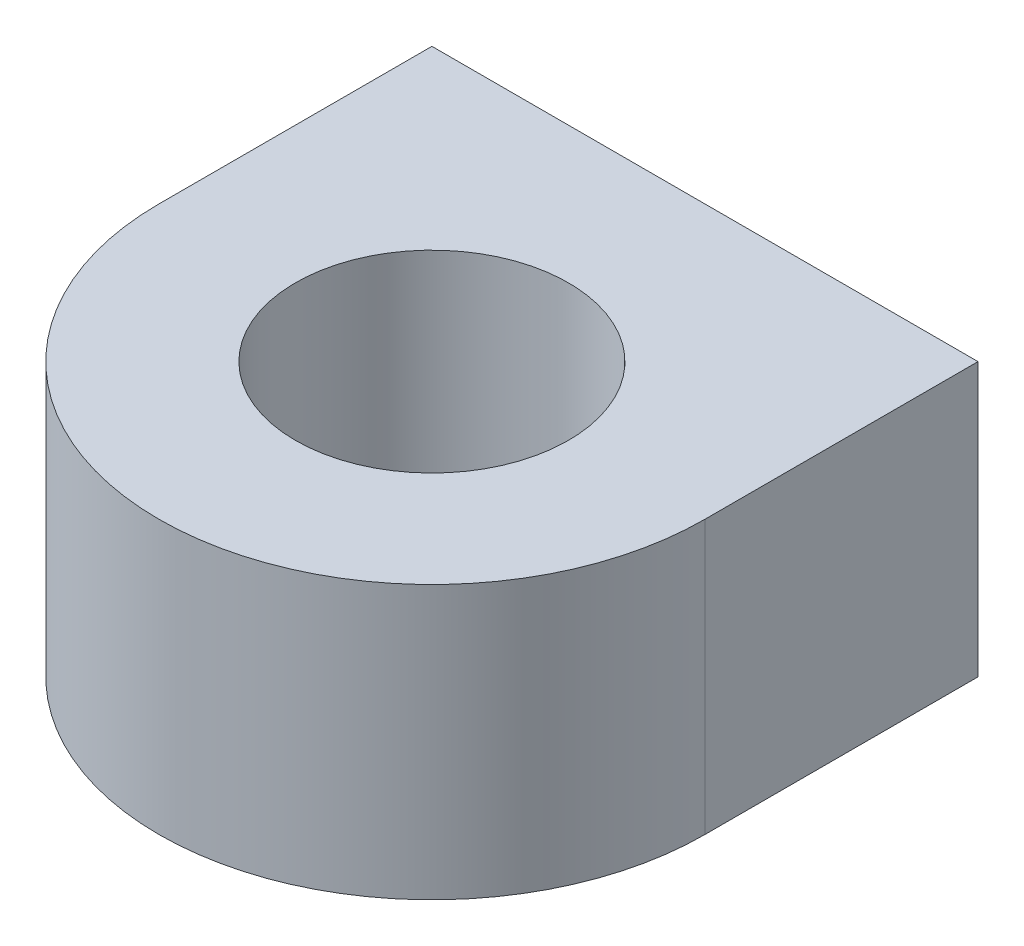
ISO-10303-21;
HEADER;
FILE_DESCRIPTION(('STEP AP214'),'2;1');
FILE_NAME('part.step','',(''),(''),'','','');
FILE_SCHEMA(('AUTOMOTIVE_DESIGN { 1 0 10303 214 1 1 1 1 }'));
ENDSEC;
DATA;
#1=APPLICATION_CONTEXT('core data for automotive mechanical design processes');
#2=APPLICATION_PROTOCOL_DEFINITION('international standard','automotive_design',2000,#1);
#3=PRODUCT_CONTEXT('',#1,'mechanical');
#4=PRODUCT('Part','Part','',(#3));
#5=PRODUCT_RELATED_PRODUCT_CATEGORY('part','',(#4));
#6=PRODUCT_DEFINITION_FORMATION('','',#4);
#7=PRODUCT_DEFINITION_CONTEXT('part definition',#1,'design');
#8=PRODUCT_DEFINITION('design','',#6,#7);
#9=PRODUCT_DEFINITION_SHAPE('','',#8);
#10=(LENGTH_UNIT() NAMED_UNIT(*) SI_UNIT(.MILLI.,.METRE.));
#11=(NAMED_UNIT(*) PLANE_ANGLE_UNIT() SI_UNIT($,.RADIAN.));
#12=(NAMED_UNIT(*) SI_UNIT($,.STERADIAN.) SOLID_ANGLE_UNIT());
#13=UNCERTAINTY_MEASURE_WITH_UNIT(LENGTH_MEASURE(1.E-05),#10,'distance_accuracy_value','');
#14=(GEOMETRIC_REPRESENTATION_CONTEXT(3) GLOBAL_UNCERTAINTY_ASSIGNED_CONTEXT((#13)) GLOBAL_UNIT_ASSIGNED_CONTEXT((#10,
#11,#12)) REPRESENTATION_CONTEXT('',''));
#15=CARTESIAN_POINT('',(0.,0.,0.));
#16=DIRECTION('',(0.,0.,1.));
#17=DIRECTION('',(1.,0.,0.));
#18=AXIS2_PLACEMENT_3D('',#15,#16,#17);
#19=CARTESIAN_POINT('',(159.769621432495,37.544015335187,10.));
#20=DIRECTION('',(0.,1.,0.));
#21=DIRECTION('',(0.,0.,1.));
#22=AXIS2_PLACEMENT_3D('',#19,#20,#21);
#23=PLANE('',#22);
#24=CARTESIAN_POINT('',(164.769621432495,37.544015335187,4.99999999999999));
#25=DIRECTION('',(0.,1.,0.));
#26=DIRECTION('',(0.,0.,1.));
#27=AXIS2_PLACEMENT_3D('',#24,#25,#26);
#28=CIRCLE('',#27,2.5);
#29=CARTESIAN_POINT('',(164.769621432495,37.544015335187,7.49999999999999));
#30=VERTEX_POINT('',#29);
#31=EDGE_CURVE('E150',#30,#30,#28,.T.);
#32=ORIENTED_EDGE('',*,*,#31,.T.);
#33=EDGE_LOOP('',(#32));
#34=FACE_BOUND('',#33,.T.);
#35=CARTESIAN_POINT('',(164.769621432495,37.544015335187,4.99999999999999));
#36=DIRECTION('',(0.,1.,0.));
#37=DIRECTION('',(0.,0.,1.));
#38=AXIS2_PLACEMENT_3D('',#35,#36,#37);
#39=CIRCLE('',#38,5.);
#40=CARTESIAN_POINT('',(159.769621432495,37.544015335187,4.99999999999999));
#41=VERTEX_POINT('',#40);
#42=CARTESIAN_POINT('',(169.769621432495,37.544015335187,4.99999999999999));
#43=VERTEX_POINT('',#42);
#44=EDGE_CURVE('E124',#41,#43,#39,.T.);
#45=ORIENTED_EDGE('',*,*,#44,.F.);
#46=DIRECTION('',(0.,0.,-1.));
#47=VECTOR('',#46,1.);
#48=CARTESIAN_POINT('',(159.769621432495,37.544015335187,10.));
#49=LINE('',#48,#47);
#50=CARTESIAN_POINT('',(159.769621432495,37.544015335187,0.));
#51=VERTEX_POINT('',#50);
#52=EDGE_CURVE('E12',#41,#51,#49,.T.);
#53=ORIENTED_EDGE('',*,*,#52,.T.);
#54=DIRECTION('',(1.,0.,0.));
#55=VECTOR('',#54,1.);
#56=CARTESIAN_POINT('',(159.769621432495,37.544015335187,0.));
#57=LINE('',#56,#55);
#58=CARTESIAN_POINT('',(169.769621432495,37.544015335187,0.));
#59=VERTEX_POINT('',#58);
#60=EDGE_CURVE('E143',#51,#59,#57,.T.);
#61=ORIENTED_EDGE('',*,*,#60,.T.);
#62=DIRECTION('',(0.,0.,-1.));
#63=VECTOR('',#62,1.);
#64=CARTESIAN_POINT('',(169.769621432495,37.544015335187,10.));
#65=LINE('',#64,#63);
#66=EDGE_CURVE('E84',#43,#59,#65,.T.);
#67=ORIENTED_EDGE('',*,*,#66,.F.);
#68=EDGE_LOOP('',(#45,#53,#61,#67));
#69=FACE_BOUND('',#68,.T.);
#70=ADVANCED_FACE('F76',(#34,#69),#23,.F.);
#71=CARTESIAN_POINT('',(159.769621432495,42.544015335187,10.));
#72=DIRECTION('',(0.,-1.,0.));
#73=DIRECTION('',(0.,0.,-1.));
#74=AXIS2_PLACEMENT_3D('',#71,#72,#73);
#75=PLANE('',#74);
#76=CARTESIAN_POINT('',(164.769621432495,42.544015335187,4.99999999999999));
#77=DIRECTION('',(0.,1.,0.));
#78=DIRECTION('',(0.,0.,1.));
#79=AXIS2_PLACEMENT_3D('',#76,#77,#78);
#80=CIRCLE('',#79,2.5);
#81=CARTESIAN_POINT('',(164.769621432495,42.544015335187,7.49999999999999));
#82=VERTEX_POINT('',#81);
#83=EDGE_CURVE('E151',#82,#82,#80,.T.);
#84=ORIENTED_EDGE('',*,*,#83,.F.);
#85=EDGE_LOOP('',(#84));
#86=FACE_BOUND('',#85,.T.);
#87=DIRECTION('',(0.,0.,-1.));
#88=VECTOR('',#87,1.);
#89=CARTESIAN_POINT('',(159.769621432495,42.544015335187,10.));
#90=LINE('',#89,#88);
#91=CARTESIAN_POINT('',(159.769621432495,42.544015335187,4.99999999999999));
#92=VERTEX_POINT('',#91);
#93=CARTESIAN_POINT('',(159.769621432495,42.544015335187,0.));
#94=VERTEX_POINT('',#93);
#95=EDGE_CURVE('E91',#92,#94,#90,.T.);
#96=ORIENTED_EDGE('',*,*,#95,.F.);
#97=CARTESIAN_POINT('',(164.769621432495,42.544015335187,4.99999999999999));
#98=DIRECTION('',(0.,1.,0.));
#99=DIRECTION('',(0.,0.,1.));
#100=AXIS2_PLACEMENT_3D('',#97,#98,#99);
#101=CIRCLE('',#100,5.);
#102=CARTESIAN_POINT('',(169.769621432495,42.544015335187,4.99999999999999));
#103=VERTEX_POINT('',#102);
#104=EDGE_CURVE('E118',#92,#103,#101,.T.);
#105=ORIENTED_EDGE('',*,*,#104,.T.);
#106=DIRECTION('',(0.,0.,-1.));
#107=VECTOR('',#106,1.);
#108=CARTESIAN_POINT('',(169.769621432495,42.544015335187,10.));
#109=LINE('',#108,#107);
#110=CARTESIAN_POINT('',(169.769621432495,42.544015335187,0.));
#111=VERTEX_POINT('',#110);
#112=EDGE_CURVE('E98',#103,#111,#109,.T.);
#113=ORIENTED_EDGE('',*,*,#112,.T.);
#114=DIRECTION('',(-1.,0.,0.));
#115=VECTOR('',#114,1.);
#116=CARTESIAN_POINT('',(159.769621432495,42.544015335187,0.));
#117=LINE('',#116,#115);
#118=EDGE_CURVE('E129',#111,#94,#117,.T.);
#119=ORIENTED_EDGE('',*,*,#118,.T.);
#120=EDGE_LOOP('',(#96,#105,#113,#119));
#121=FACE_BOUND('',#120,.T.);
#122=ADVANCED_FACE('F127',(#86,#121),#75,.F.);
#123=CARTESIAN_POINT('',(169.769621432495,42.544015335187,10.));
#124=DIRECTION('',(-1.,0.,0.));
#125=DIRECTION('',(0.,0.,1.));
#126=AXIS2_PLACEMENT_3D('',#123,#124,#125);
#127=PLANE('',#126);
#128=DIRECTION('',(0.,1.,0.));
#129=VECTOR('',#128,1.);
#130=CARTESIAN_POINT('',(169.769621432495,37.544015335187,4.99999999999999));
#131=LINE('',#130,#129);
#132=EDGE_CURVE('E123',#43,#103,#131,.T.);
#133=ORIENTED_EDGE('',*,*,#132,.F.);
#134=ORIENTED_EDGE('',*,*,#66,.T.);
#135=DIRECTION('',(0.,1.,0.));
#136=VECTOR('',#135,1.);
#137=CARTESIAN_POINT('',(169.769621432495,42.544015335187,0.));
#138=LINE('',#137,#136);
#139=EDGE_CURVE('E133',#59,#111,#138,.T.);
#140=ORIENTED_EDGE('',*,*,#139,.T.);
#141=ORIENTED_EDGE('',*,*,#112,.F.);
#142=EDGE_LOOP('',(#133,#134,#140,#141));
#143=FACE_BOUND('',#142,.T.);
#144=ADVANCED_FACE('F139',(#143),#127,.F.);
#145=CARTESIAN_POINT('',(159.769621432495,42.544015335187,10.));
#146=DIRECTION('',(1.,0.,0.));
#147=DIRECTION('',(0.,0.,-1.));
#148=AXIS2_PLACEMENT_3D('',#145,#146,#147);
#149=PLANE('',#148);
#150=ORIENTED_EDGE('',*,*,#52,.F.);
#151=DIRECTION('',(0.,1.,0.));
#152=VECTOR('',#151,1.);
#153=CARTESIAN_POINT('',(159.769621432495,37.544015335187,4.99999999999999));
#154=LINE('',#153,#152);
#155=EDGE_CURVE('E120',#41,#92,#154,.T.);
#156=ORIENTED_EDGE('',*,*,#155,.T.);
#157=ORIENTED_EDGE('',*,*,#95,.T.);
#158=DIRECTION('',(0.,-1.,0.));
#159=VECTOR('',#158,1.);
#160=CARTESIAN_POINT('',(159.769621432495,42.544015335187,0.));
#161=LINE('',#160,#159);
#162=EDGE_CURVE('E145',#94,#51,#161,.T.);
#163=ORIENTED_EDGE('',*,*,#162,.T.);
#164=EDGE_LOOP('',(#150,#156,#157,#163));
#165=FACE_BOUND('',#164,.T.);
#166=ADVANCED_FACE('F78',(#165),#149,.F.);
#167=CARTESIAN_POINT('',(0.,0.,0.));
#168=DIRECTION('',(0.,0.,1.));
#169=DIRECTION('',(1.,0.,0.));
#170=AXIS2_PLACEMENT_3D('',#167,#168,#169);
#171=PLANE('',#170);
#172=ORIENTED_EDGE('',*,*,#162,.F.);
#173=ORIENTED_EDGE('',*,*,#118,.F.);
#174=ORIENTED_EDGE('',*,*,#139,.F.);
#175=ORIENTED_EDGE('',*,*,#60,.F.);
#176=EDGE_LOOP('',(#172,#173,#174,#175));
#177=FACE_BOUND('',#176,.T.);
#178=ADVANCED_FACE('F147',(#177),#171,.F.);
#179=CARTESIAN_POINT('',(164.769621432495,37.544015335187,4.99999999999999));
#180=DIRECTION('',(0.,1.,0.));
#181=DIRECTION('',(0.,0.,1.));
#182=AXIS2_PLACEMENT_3D('',#179,#180,#181);
#183=CYLINDRICAL_SURFACE('',#182,2.5);
#184=ORIENTED_EDGE('',*,*,#31,.F.);
#185=EDGE_LOOP('',(#184));
#186=FACE_BOUND('',#185,.T.);
#187=ORIENTED_EDGE('',*,*,#83,.T.);
#188=EDGE_LOOP('',(#187));
#189=FACE_BOUND('',#188,.T.);
#190=ADVANCED_FACE('F160',(#186,#189),#183,.F.);
#191=CARTESIAN_POINT('',(164.769621432495,37.544015335187,4.99999999999999));
#192=DIRECTION('',(0.,1.,0.));
#193=DIRECTION('',(0.,0.,1.));
#194=AXIS2_PLACEMENT_3D('',#191,#192,#193);
#195=CYLINDRICAL_SURFACE('',#194,5.);
#196=ORIENTED_EDGE('',*,*,#104,.F.);
#197=ORIENTED_EDGE('',*,*,#155,.F.);
#198=ORIENTED_EDGE('',*,*,#44,.T.);
#199=ORIENTED_EDGE('',*,*,#132,.T.);
#200=EDGE_LOOP('',(#196,#197,#198,#199));
#201=FACE_BOUND('',#200,.T.);
#202=ADVANCED_FACE('F119',(#201),#195,.T.);
#203=CLOSED_SHELL('',(#70,#122,#144,#166,#178,#190,#202));
#204=MANIFOLD_SOLID_BREP('B2',#203);
#205=ADVANCED_BREP_SHAPE_REPRESENTATION('',(#18,#204),#14);
#206=SHAPE_DEFINITION_REPRESENTATION(#9,#205);
ENDSEC;
END-ISO-10303-21;
